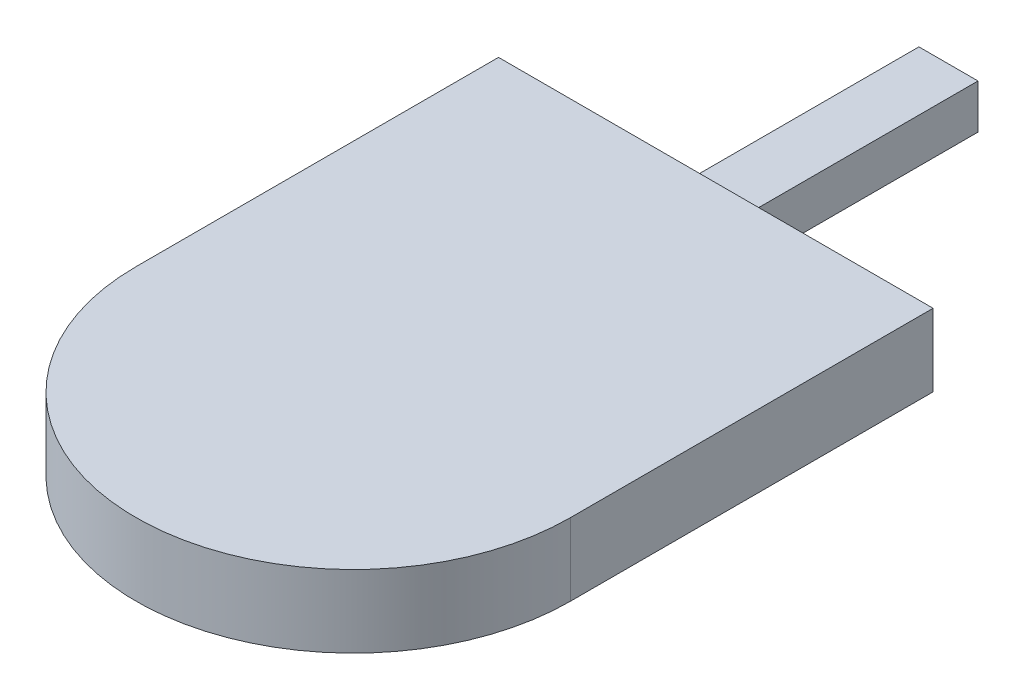
ISO-10303-21;
HEADER;
FILE_DESCRIPTION(('STEP AP214'),'2;1');
FILE_NAME('part.step','',(''),(''),'','','');
FILE_SCHEMA(('AUTOMOTIVE_DESIGN { 1 0 10303 214 1 1 1 1 }'));
ENDSEC;
DATA;
#1=APPLICATION_CONTEXT('core data for automotive mechanical design processes');
#2=APPLICATION_PROTOCOL_DEFINITION('international standard','automotive_design',2000,#1);
#3=PRODUCT_CONTEXT('',#1,'mechanical');
#4=PRODUCT('Part','Part','',(#3));
#5=PRODUCT_RELATED_PRODUCT_CATEGORY('part','',(#4));
#6=PRODUCT_DEFINITION_FORMATION('','',#4);
#7=PRODUCT_DEFINITION_CONTEXT('part definition',#1,'design');
#8=PRODUCT_DEFINITION('design','',#6,#7);
#9=PRODUCT_DEFINITION_SHAPE('','',#8);
#10=(LENGTH_UNIT() NAMED_UNIT(*) SI_UNIT(.MILLI.,.METRE.));
#11=(NAMED_UNIT(*) PLANE_ANGLE_UNIT() SI_UNIT($,.RADIAN.));
#12=(NAMED_UNIT(*) SI_UNIT($,.STERADIAN.) SOLID_ANGLE_UNIT());
#13=UNCERTAINTY_MEASURE_WITH_UNIT(LENGTH_MEASURE(1.E-05),#10,'distance_accuracy_value','');
#14=(GEOMETRIC_REPRESENTATION_CONTEXT(3) GLOBAL_UNCERTAINTY_ASSIGNED_CONTEXT((#13)) GLOBAL_UNIT_ASSIGNED_CONTEXT((#10,
#11,#12)) REPRESENTATION_CONTEXT('',''));
#15=CARTESIAN_POINT('',(0.,0.,0.));
#16=DIRECTION('',(0.,0.,1.));
#17=DIRECTION('',(1.,0.,0.));
#18=AXIS2_PLACEMENT_3D('',#15,#16,#17);
#19=CARTESIAN_POINT('',(0.,8.,0.));
#20=DIRECTION('',(0.,0.,-1.));
#21=DIRECTION('',(-1.,0.,0.));
#22=AXIS2_PLACEMENT_3D('',#19,#20,#21);
#23=PLANE('',#22);
#24=DIRECTION('',(1.,0.,0.));
#25=VECTOR('',#24,1.);
#26=CARTESIAN_POINT('',(0.,0.,0.));
#27=LINE('',#26,#25);
#28=CARTESIAN_POINT('',(-23.9984210124947,0.,0.));
#29=VERTEX_POINT('',#28);
#30=CARTESIAN_POINT('',(23.9984210124946,0.,0.));
#31=VERTEX_POINT('',#30);
#32=EDGE_CURVE('E144',#29,#31,#27,.T.);
#33=ORIENTED_EDGE('',*,*,#32,.F.);
#34=DIRECTION('',(0.,-1.,0.));
#35=VECTOR('',#34,1.);
#36=CARTESIAN_POINT('',(-23.9984210124947,8.,0.));
#37=LINE('',#36,#35);
#38=CARTESIAN_POINT('',(-23.9984210124947,8.,0.));
#39=VERTEX_POINT('',#38);
#40=EDGE_CURVE('E61',#39,#29,#37,.T.);
#41=ORIENTED_EDGE('',*,*,#40,.F.);
#42=DIRECTION('',(1.,0.,0.));
#43=VECTOR('',#42,1.);
#44=CARTESIAN_POINT('',(0.,8.,0.));
#45=LINE('',#44,#43);
#46=CARTESIAN_POINT('',(23.9984210124946,8.,0.));
#47=VERTEX_POINT('',#46);
#48=EDGE_CURVE('E149',#39,#47,#45,.T.);
#49=ORIENTED_EDGE('',*,*,#48,.T.);
#50=DIRECTION('',(0.,-1.,0.));
#51=VECTOR('',#50,1.);
#52=CARTESIAN_POINT('',(23.9984210124946,8.,0.));
#53=LINE('',#52,#51);
#54=EDGE_CURVE('E159',#47,#31,#53,.T.);
#55=ORIENTED_EDGE('',*,*,#54,.T.);
#56=EDGE_LOOP('',(#33,#41,#49,#55));
#57=FACE_BOUND('',#56,.T.);
#58=DIRECTION('',(1.,0.,0.));
#59=VECTOR('',#58,1.);
#60=CARTESIAN_POINT('',(3.95958317461442,7.22209595286927,0.));
#61=LINE('',#60,#59);
#62=CARTESIAN_POINT('',(-2.56534863999036,7.22209595286927,0.));
#63=VERTEX_POINT('',#62);
#64=CARTESIAN_POINT('',(3.95958317461442,7.22209595286927,0.));
#65=VERTEX_POINT('',#64);
#66=EDGE_CURVE('E275',#63,#65,#61,.T.);
#67=ORIENTED_EDGE('',*,*,#66,.F.);
#68=DIRECTION('',(0.,1.,0.));
#69=VECTOR('',#68,1.);
#70=CARTESIAN_POINT('',(-2.56534863999036,7.22209595286927,0.));
#71=LINE('',#70,#69);
#72=CARTESIAN_POINT('',(-2.56534863999036,2.32820417852508,0.));
#73=VERTEX_POINT('',#72);
#74=EDGE_CURVE('E133',#73,#63,#71,.T.);
#75=ORIENTED_EDGE('',*,*,#74,.F.);
#76=DIRECTION('',(-1.,0.,0.));
#77=VECTOR('',#76,1.);
#78=CARTESIAN_POINT('',(3.95958317461442,2.32820417852508,0.));
#79=LINE('',#78,#77);
#80=CARTESIAN_POINT('',(3.95958317461442,2.32820417852508,0.));
#81=VERTEX_POINT('',#80);
#82=EDGE_CURVE('E129',#81,#73,#79,.T.);
#83=ORIENTED_EDGE('',*,*,#82,.F.);
#84=DIRECTION('',(0.,-1.,0.));
#85=VECTOR('',#84,1.);
#86=CARTESIAN_POINT('',(3.95958317461442,7.22209595286927,0.));
#87=LINE('',#86,#85);
#88=EDGE_CURVE('E272',#65,#81,#87,.T.);
#89=ORIENTED_EDGE('',*,*,#88,.F.);
#90=EDGE_LOOP('',(#67,#75,#83,#89));
#91=FACE_BOUND('',#90,.T.);
#92=ADVANCED_FACE('F37',(#57,#91),#23,.T.);
#93=CARTESIAN_POINT('',(-23.9984210124947,8.,0.));
#94=DIRECTION('',(1.,0.,0.));
#95=DIRECTION('',(0.,0.,-1.));
#96=AXIS2_PLACEMENT_3D('',#93,#94,#95);
#97=PLANE('',#96);
#98=DIRECTION('',(0.,0.,1.));
#99=VECTOR('',#98,1.);
#100=CARTESIAN_POINT('',(-23.9984210124947,0.,0.));
#101=LINE('',#100,#99);
#102=CARTESIAN_POINT('',(-23.9984210124947,0.,40.04621649));
#103=VERTEX_POINT('',#102);
#104=EDGE_CURVE('E135',#29,#103,#101,.T.);
#105=ORIENTED_EDGE('',*,*,#104,.T.);
#106=DIRECTION('',(0.,-1.,0.));
#107=VECTOR('',#106,1.);
#108=CARTESIAN_POINT('',(-23.9984210124947,8.,40.04621649));
#109=LINE('',#108,#107);
#110=CARTESIAN_POINT('',(-23.9984210124947,8.,40.04621649));
#111=VERTEX_POINT('',#110);
#112=EDGE_CURVE('E11',#111,#103,#109,.T.);
#113=ORIENTED_EDGE('',*,*,#112,.F.);
#114=DIRECTION('',(0.,0.,1.));
#115=VECTOR('',#114,1.);
#116=CARTESIAN_POINT('',(-23.9984210124947,8.,0.));
#117=LINE('',#116,#115);
#118=EDGE_CURVE('E142',#39,#111,#117,.T.);
#119=ORIENTED_EDGE('',*,*,#118,.F.);
#120=ORIENTED_EDGE('',*,*,#40,.T.);
#121=EDGE_LOOP('',(#105,#113,#119,#120));
#122=FACE_BOUND('',#121,.T.);
#123=ADVANCED_FACE('F39',(#122),#97,.F.);
#124=CARTESIAN_POINT('',(0.,8.,40.04621649));
#125=DIRECTION('',(0.,-1.,0.));
#126=DIRECTION('',(0.,0.,-1.));
#127=AXIS2_PLACEMENT_3D('',#124,#125,#126);
#128=CYLINDRICAL_SURFACE('',#127,23.9984210124946);
#129=CARTESIAN_POINT('',(0.,0.,40.04621649));
#130=DIRECTION('',(0.,1.,0.));
#131=DIRECTION('',(0.,0.,1.));
#132=AXIS2_PLACEMENT_3D('',#129,#130,#131);
#133=CIRCLE('',#132,23.9984210124946);
#134=CARTESIAN_POINT('',(23.9984210124946,0.,40.04621649));
#135=VERTEX_POINT('',#134);
#136=EDGE_CURVE('E137',#103,#135,#133,.T.);
#137=ORIENTED_EDGE('',*,*,#136,.T.);
#138=DIRECTION('',(0.,-1.,0.));
#139=VECTOR('',#138,1.);
#140=CARTESIAN_POINT('',(23.9984210124946,8.,40.04621649));
#141=LINE('',#140,#139);
#142=CARTESIAN_POINT('',(23.9984210124946,8.,40.04621649));
#143=VERTEX_POINT('',#142);
#144=EDGE_CURVE('E45',#143,#135,#141,.T.);
#145=ORIENTED_EDGE('',*,*,#144,.F.);
#146=CARTESIAN_POINT('',(0.,8.,40.04621649));
#147=DIRECTION('',(0.,1.,0.));
#148=DIRECTION('',(0.,0.,1.));
#149=AXIS2_PLACEMENT_3D('',#146,#147,#148);
#150=CIRCLE('',#149,23.9984210124946);
#151=EDGE_CURVE('E87',#111,#143,#150,.T.);
#152=ORIENTED_EDGE('',*,*,#151,.F.);
#153=ORIENTED_EDGE('',*,*,#112,.T.);
#154=EDGE_LOOP('',(#137,#145,#152,#153));
#155=FACE_BOUND('',#154,.T.);
#156=ADVANCED_FACE('F164',(#155),#128,.T.);
#157=CARTESIAN_POINT('',(23.9984210124946,8.,0.));
#158=DIRECTION('',(1.,0.,0.));
#159=DIRECTION('',(0.,0.,-1.));
#160=AXIS2_PLACEMENT_3D('',#157,#158,#159);
#161=PLANE('',#160);
#162=DIRECTION('',(0.,0.,1.));
#163=VECTOR('',#162,1.);
#164=CARTESIAN_POINT('',(23.9984210124946,0.,0.));
#165=LINE('',#164,#163);
#166=EDGE_CURVE('E153',#31,#135,#165,.T.);
#167=ORIENTED_EDGE('',*,*,#166,.F.);
#168=ORIENTED_EDGE('',*,*,#54,.F.);
#169=DIRECTION('',(0.,0.,1.));
#170=VECTOR('',#169,1.);
#171=CARTESIAN_POINT('',(23.9984210124946,8.,0.));
#172=LINE('',#171,#170);
#173=EDGE_CURVE('E146',#47,#143,#172,.T.);
#174=ORIENTED_EDGE('',*,*,#173,.T.);
#175=ORIENTED_EDGE('',*,*,#144,.T.);
#176=EDGE_LOOP('',(#167,#168,#174,#175));
#177=FACE_BOUND('',#176,.T.);
#178=ADVANCED_FACE('F162',(#177),#161,.T.);
#179=CARTESIAN_POINT('',(0.,8.,0.));
#180=DIRECTION('',(0.,1.,0.));
#181=DIRECTION('',(0.,0.,1.));
#182=AXIS2_PLACEMENT_3D('',#179,#180,#181);
#183=PLANE('',#182);
#184=ORIENTED_EDGE('',*,*,#118,.T.);
#185=ORIENTED_EDGE('',*,*,#151,.T.);
#186=ORIENTED_EDGE('',*,*,#173,.F.);
#187=ORIENTED_EDGE('',*,*,#48,.F.);
#188=EDGE_LOOP('',(#184,#185,#186,#187));
#189=FACE_BOUND('',#188,.T.);
#190=ADVANCED_FACE('F171',(#189),#183,.T.);
#191=CARTESIAN_POINT('',(0.,0.,0.));
#192=DIRECTION('',(0.,1.,0.));
#193=DIRECTION('',(0.,0.,1.));
#194=AXIS2_PLACEMENT_3D('',#191,#192,#193);
#195=PLANE('',#194);
#196=ORIENTED_EDGE('',*,*,#104,.F.);
#197=ORIENTED_EDGE('',*,*,#32,.T.);
#198=ORIENTED_EDGE('',*,*,#166,.T.);
#199=ORIENTED_EDGE('',*,*,#136,.F.);
#200=EDGE_LOOP('',(#196,#197,#198,#199));
#201=FACE_BOUND('',#200,.T.);
#202=ADVANCED_FACE('F167',(#201),#195,.F.);
#203=CARTESIAN_POINT('',(-2.56534863999036,7.22209595286927,-25.));
#204=DIRECTION('',(1.,0.,0.));
#205=DIRECTION('',(0.,0.,-1.));
#206=AXIS2_PLACEMENT_3D('',#203,#204,#205);
#207=PLANE('',#206);
#208=ORIENTED_EDGE('',*,*,#74,.T.);
#209=DIRECTION('',(0.,0.,1.));
#210=VECTOR('',#209,1.);
#211=CARTESIAN_POINT('',(-2.56534863999036,7.22209595286927,-25.));
#212=LINE('',#211,#210);
#213=CARTESIAN_POINT('',(-2.56534863999036,7.22209595286927,-25.));
#214=VERTEX_POINT('',#213);
#215=EDGE_CURVE('E114',#214,#63,#212,.T.);
#216=ORIENTED_EDGE('',*,*,#215,.F.);
#217=DIRECTION('',(0.,1.,0.));
#218=VECTOR('',#217,1.);
#219=CARTESIAN_POINT('',(-2.56534863999036,7.22209595286927,-25.));
#220=LINE('',#219,#218);
#221=CARTESIAN_POINT('',(-2.56534863999036,2.32820417852508,-25.));
#222=VERTEX_POINT('',#221);
#223=EDGE_CURVE('E121',#222,#214,#220,.T.);
#224=ORIENTED_EDGE('',*,*,#223,.F.);
#225=DIRECTION('',(0.,0.,1.));
#226=VECTOR('',#225,1.);
#227=CARTESIAN_POINT('',(-2.56534863999036,2.32820417852508,-25.));
#228=LINE('',#227,#226);
#229=EDGE_CURVE('E270',#222,#73,#228,.T.);
#230=ORIENTED_EDGE('',*,*,#229,.T.);
#231=EDGE_LOOP('',(#208,#216,#224,#230));
#232=FACE_BOUND('',#231,.T.);
#233=ADVANCED_FACE('F131',(#232),#207,.F.);
#234=CARTESIAN_POINT('',(3.95958317461442,7.22209595286927,-25.));
#235=DIRECTION('',(0.,-1.,0.));
#236=DIRECTION('',(0.,0.,-1.));
#237=AXIS2_PLACEMENT_3D('',#234,#235,#236);
#238=PLANE('',#237);
#239=ORIENTED_EDGE('',*,*,#66,.T.);
#240=DIRECTION('',(0.,0.,1.));
#241=VECTOR('',#240,1.);
#242=CARTESIAN_POINT('',(3.95958317461442,7.22209595286927,-25.));
#243=LINE('',#242,#241);
#244=CARTESIAN_POINT('',(3.95958317461442,7.22209595286927,-25.));
#245=VERTEX_POINT('',#244);
#246=EDGE_CURVE('E117',#245,#65,#243,.T.);
#247=ORIENTED_EDGE('',*,*,#246,.F.);
#248=DIRECTION('',(1.,0.,0.));
#249=VECTOR('',#248,1.);
#250=CARTESIAN_POINT('',(3.95958317461442,7.22209595286927,-25.));
#251=LINE('',#250,#249);
#252=EDGE_CURVE('E110',#214,#245,#251,.T.);
#253=ORIENTED_EDGE('',*,*,#252,.F.);
#254=ORIENTED_EDGE('',*,*,#215,.T.);
#255=EDGE_LOOP('',(#239,#247,#253,#254));
#256=FACE_BOUND('',#255,.T.);
#257=ADVANCED_FACE('F112',(#256),#238,.F.);
#258=CARTESIAN_POINT('',(3.95958317461442,7.22209595286927,-25.));
#259=DIRECTION('',(-1.,0.,0.));
#260=DIRECTION('',(0.,0.,1.));
#261=AXIS2_PLACEMENT_3D('',#258,#259,#260);
#262=PLANE('',#261);
#263=ORIENTED_EDGE('',*,*,#88,.T.);
#264=DIRECTION('',(0.,0.,1.));
#265=VECTOR('',#264,1.);
#266=CARTESIAN_POINT('',(3.95958317461442,2.32820417852508,-25.));
#267=LINE('',#266,#265);
#268=CARTESIAN_POINT('',(3.95958317461442,2.32820417852508,-25.));
#269=VERTEX_POINT('',#268);
#270=EDGE_CURVE('E52',#269,#81,#267,.T.);
#271=ORIENTED_EDGE('',*,*,#270,.F.);
#272=DIRECTION('',(0.,-1.,0.));
#273=VECTOR('',#272,1.);
#274=CARTESIAN_POINT('',(3.95958317461442,7.22209595286927,-25.));
#275=LINE('',#274,#273);
#276=EDGE_CURVE('E120',#245,#269,#275,.T.);
#277=ORIENTED_EDGE('',*,*,#276,.F.);
#278=ORIENTED_EDGE('',*,*,#246,.T.);
#279=EDGE_LOOP('',(#263,#271,#277,#278));
#280=FACE_BOUND('',#279,.T.);
#281=ADVANCED_FACE('F195',(#280),#262,.F.);
#282=CARTESIAN_POINT('',(3.95958317461442,2.32820417852508,-25.));
#283=DIRECTION('',(0.,1.,0.));
#284=DIRECTION('',(0.,0.,1.));
#285=AXIS2_PLACEMENT_3D('',#282,#283,#284);
#286=PLANE('',#285);
#287=ORIENTED_EDGE('',*,*,#82,.T.);
#288=ORIENTED_EDGE('',*,*,#229,.F.);
#289=DIRECTION('',(-1.,0.,0.));
#290=VECTOR('',#289,1.);
#291=CARTESIAN_POINT('',(3.95958317461442,2.32820417852508,-25.));
#292=LINE('',#291,#290);
#293=EDGE_CURVE('E125',#269,#222,#292,.T.);
#294=ORIENTED_EDGE('',*,*,#293,.F.);
#295=ORIENTED_EDGE('',*,*,#270,.T.);
#296=EDGE_LOOP('',(#287,#288,#294,#295));
#297=FACE_BOUND('',#296,.T.);
#298=ADVANCED_FACE('F198',(#297),#286,.F.);
#299=CARTESIAN_POINT('',(0.,0.,-25.));
#300=DIRECTION('',(0.,0.,-1.));
#301=DIRECTION('',(-1.,0.,0.));
#302=AXIS2_PLACEMENT_3D('',#299,#300,#301);
#303=PLANE('',#302);
#304=ORIENTED_EDGE('',*,*,#223,.T.);
#305=ORIENTED_EDGE('',*,*,#252,.T.);
#306=ORIENTED_EDGE('',*,*,#276,.T.);
#307=ORIENTED_EDGE('',*,*,#293,.T.);
#308=EDGE_LOOP('',(#304,#305,#306,#307));
#309=FACE_BOUND('',#308,.T.);
#310=ADVANCED_FACE('F124',(#309),#303,.T.);
#311=CLOSED_SHELL('',(#92,#123,#156,#178,#190,#202,#233,#257,#281,#298,#310));
#312=MANIFOLD_SOLID_BREP('B2',#311);
#313=ADVANCED_BREP_SHAPE_REPRESENTATION('',(#18,#312),#14);
#314=SHAPE_DEFINITION_REPRESENTATION(#9,#313);
ENDSEC;
END-ISO-10303-21;
